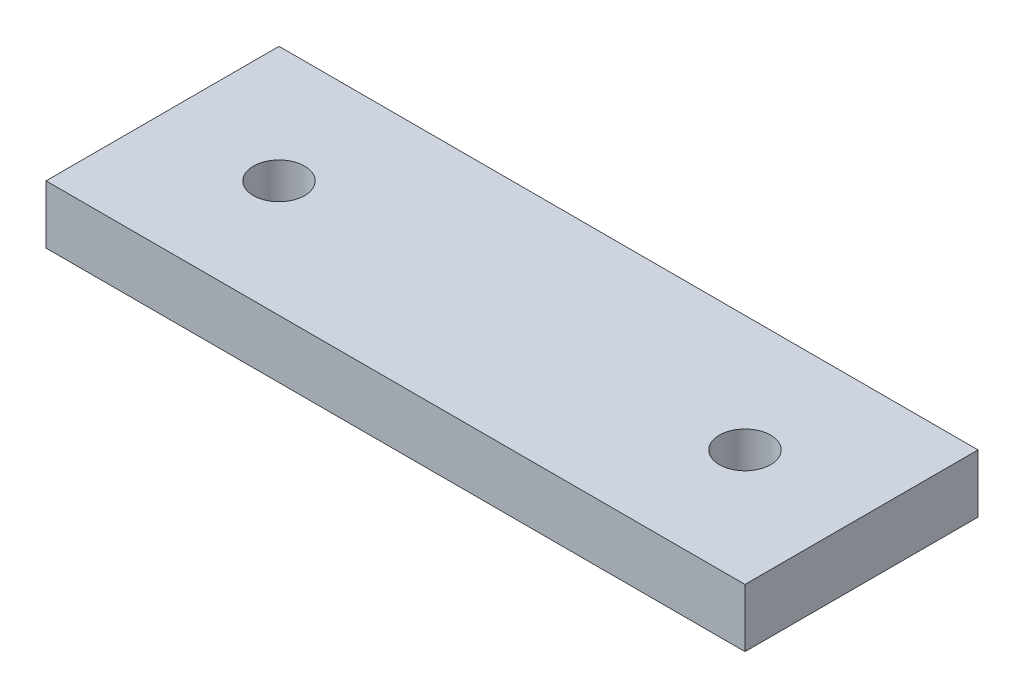
ISO-10303-21;
HEADER;
FILE_DESCRIPTION(('STEP AP214'),'2;1');
FILE_NAME('part.step','',(''),(''),'','','');
FILE_SCHEMA(('AUTOMOTIVE_DESIGN { 1 0 10303 214 1 1 1 1 }'));
ENDSEC;
DATA;
#1=APPLICATION_CONTEXT('core data for automotive mechanical design processes');
#2=APPLICATION_PROTOCOL_DEFINITION('international standard','automotive_design',2000,#1);
#3=PRODUCT_CONTEXT('',#1,'mechanical');
#4=PRODUCT('Part','Part','',(#3));
#5=PRODUCT_RELATED_PRODUCT_CATEGORY('part','',(#4));
#6=PRODUCT_DEFINITION_FORMATION('','',#4);
#7=PRODUCT_DEFINITION_CONTEXT('part definition',#1,'design');
#8=PRODUCT_DEFINITION('design','',#6,#7);
#9=PRODUCT_DEFINITION_SHAPE('','',#8);
#10=(LENGTH_UNIT() NAMED_UNIT(*) SI_UNIT(.MILLI.,.METRE.));
#11=(NAMED_UNIT(*) PLANE_ANGLE_UNIT() SI_UNIT($,.RADIAN.));
#12=(NAMED_UNIT(*) SI_UNIT($,.STERADIAN.) SOLID_ANGLE_UNIT());
#13=UNCERTAINTY_MEASURE_WITH_UNIT(LENGTH_MEASURE(1.E-05),#10,'distance_accuracy_value','');
#14=(GEOMETRIC_REPRESENTATION_CONTEXT(3) GLOBAL_UNCERTAINTY_ASSIGNED_CONTEXT((#13)) GLOBAL_UNIT_ASSIGNED_CONTEXT((#10,
#11,#12)) REPRESENTATION_CONTEXT('',''));
#15=CARTESIAN_POINT('',(0.,0.,0.));
#16=DIRECTION('',(0.,0.,1.));
#17=DIRECTION('',(1.,0.,0.));
#18=AXIS2_PLACEMENT_3D('',#15,#16,#17);
#19=CARTESIAN_POINT('',(0.,6.35,0.));
#20=DIRECTION('',(0.,-1.,0.));
#21=DIRECTION('',(0.,0.,-1.));
#22=AXIS2_PLACEMENT_3D('',#19,#20,#21);
#23=PLANE('',#22);
#24=DIRECTION('',(0.,0.,1.));
#25=VECTOR('',#24,1.);
#26=CARTESIAN_POINT('',(0.,6.35,0.));
#27=LINE('',#26,#25);
#28=CARTESIAN_POINT('',(0.,6.35,-25.4));
#29=VERTEX_POINT('',#28);
#30=CARTESIAN_POINT('',(0.,6.35,0.));
#31=VERTEX_POINT('',#30);
#32=EDGE_CURVE('E87',#29,#31,#27,.T.);
#33=ORIENTED_EDGE('',*,*,#32,.T.);
#34=DIRECTION('',(1.,0.,0.));
#35=VECTOR('',#34,1.);
#36=CARTESIAN_POINT('',(0.,6.35,0.));
#37=LINE('',#36,#35);
#38=CARTESIAN_POINT('',(76.2,6.35,0.));
#39=VERTEX_POINT('',#38);
#40=EDGE_CURVE('E82',#31,#39,#37,.T.);
#41=ORIENTED_EDGE('',*,*,#40,.T.);
#42=DIRECTION('',(0.,0.,-1.));
#43=VECTOR('',#42,1.);
#44=CARTESIAN_POINT('',(76.2,6.35,0.));
#45=LINE('',#44,#43);
#46=CARTESIAN_POINT('',(76.2,6.35,-25.4));
#47=VERTEX_POINT('',#46);
#48=EDGE_CURVE('E85',#39,#47,#45,.T.);
#49=ORIENTED_EDGE('',*,*,#48,.T.);
#50=DIRECTION('',(-1.,0.,0.));
#51=VECTOR('',#50,1.);
#52=CARTESIAN_POINT('',(0.,6.35,-25.4));
#53=LINE('',#52,#51);
#54=EDGE_CURVE('E52',#47,#29,#53,.T.);
#55=ORIENTED_EDGE('',*,*,#54,.T.);
#56=EDGE_LOOP('',(#33,#41,#49,#55));
#57=FACE_BOUND('',#56,.T.);
#58=CARTESIAN_POINT('',(63.5,6.35,-12.7));
#59=DIRECTION('',(0.,1.,0.));
#60=DIRECTION('',(0.,0.,1.));
#61=AXIS2_PLACEMENT_3D('',#58,#59,#60);
#62=CIRCLE('',#61,2.79400000000001);
#63=CARTESIAN_POINT('',(63.5,6.35,-9.90599999999999));
#64=VERTEX_POINT('',#63);
#65=EDGE_CURVE('E102',#64,#64,#62,.T.);
#66=ORIENTED_EDGE('',*,*,#65,.F.);
#67=EDGE_LOOP('',(#66));
#68=FACE_BOUND('',#67,.T.);
#69=CARTESIAN_POINT('',(12.7,6.35,-12.7));
#70=DIRECTION('',(0.,1.,0.));
#71=DIRECTION('',(0.,0.,1.));
#72=AXIS2_PLACEMENT_3D('',#69,#70,#71);
#73=CIRCLE('',#72,2.794);
#74=CARTESIAN_POINT('',(12.7,6.35,-9.906));
#75=VERTEX_POINT('',#74);
#76=EDGE_CURVE('E117',#75,#75,#73,.T.);
#77=ORIENTED_EDGE('',*,*,#76,.F.);
#78=EDGE_LOOP('',(#77));
#79=FACE_BOUND('',#78,.T.);
#80=ADVANCED_FACE('F35',(#57,#68,#79),#23,.F.);
#81=CARTESIAN_POINT('',(0.,0.,0.));
#82=DIRECTION('',(0.,-1.,0.));
#83=DIRECTION('',(0.,0.,-1.));
#84=AXIS2_PLACEMENT_3D('',#81,#82,#83);
#85=PLANE('',#84);
#86=CARTESIAN_POINT('',(63.5,0.,-12.7));
#87=DIRECTION('',(0.,1.,0.));
#88=DIRECTION('',(0.,0.,1.));
#89=AXIS2_PLACEMENT_3D('',#86,#87,#88);
#90=CIRCLE('',#89,2.79400000000001);
#91=CARTESIAN_POINT('',(63.5,0.,-9.90599999999999));
#92=VERTEX_POINT('',#91);
#93=EDGE_CURVE('E114',#92,#92,#90,.T.);
#94=ORIENTED_EDGE('',*,*,#93,.T.);
#95=EDGE_LOOP('',(#94));
#96=FACE_BOUND('',#95,.T.);
#97=DIRECTION('',(0.,0.,1.));
#98=VECTOR('',#97,1.);
#99=CARTESIAN_POINT('',(0.,0.,0.));
#100=LINE('',#99,#98);
#101=CARTESIAN_POINT('',(0.,0.,-25.4));
#102=VERTEX_POINT('',#101);
#103=CARTESIAN_POINT('',(0.,0.,0.));
#104=VERTEX_POINT('',#103);
#105=EDGE_CURVE('E99',#102,#104,#100,.T.);
#106=ORIENTED_EDGE('',*,*,#105,.F.);
#107=DIRECTION('',(-1.,0.,0.));
#108=VECTOR('',#107,1.);
#109=CARTESIAN_POINT('',(0.,0.,-25.4));
#110=LINE('',#109,#108);
#111=CARTESIAN_POINT('',(76.2,0.,-25.4));
#112=VERTEX_POINT('',#111);
#113=EDGE_CURVE('E75',#112,#102,#110,.T.);
#114=ORIENTED_EDGE('',*,*,#113,.F.);
#115=DIRECTION('',(0.,0.,-1.));
#116=VECTOR('',#115,1.);
#117=CARTESIAN_POINT('',(76.2,0.,0.));
#118=LINE('',#117,#116);
#119=CARTESIAN_POINT('',(76.2,0.,0.));
#120=VERTEX_POINT('',#119);
#121=EDGE_CURVE('E69',#120,#112,#118,.T.);
#122=ORIENTED_EDGE('',*,*,#121,.F.);
#123=DIRECTION('',(1.,0.,0.));
#124=VECTOR('',#123,1.);
#125=CARTESIAN_POINT('',(0.,0.,0.));
#126=LINE('',#125,#124);
#127=EDGE_CURVE('E91',#104,#120,#126,.T.);
#128=ORIENTED_EDGE('',*,*,#127,.F.);
#129=EDGE_LOOP('',(#106,#114,#122,#128));
#130=FACE_BOUND('',#129,.T.);
#131=CARTESIAN_POINT('',(12.7,0.,-12.7));
#132=DIRECTION('',(0.,1.,0.));
#133=DIRECTION('',(0.,0.,1.));
#134=AXIS2_PLACEMENT_3D('',#131,#132,#133);
#135=CIRCLE('',#134,2.794);
#136=CARTESIAN_POINT('',(12.7,0.,-9.906));
#137=VERTEX_POINT('',#136);
#138=EDGE_CURVE('E120',#137,#137,#135,.T.);
#139=ORIENTED_EDGE('',*,*,#138,.T.);
#140=EDGE_LOOP('',(#139));
#141=FACE_BOUND('',#140,.T.);
#142=ADVANCED_FACE('F110',(#96,#130,#141),#85,.T.);
#143=CARTESIAN_POINT('',(0.,6.35,0.));
#144=DIRECTION('',(1.,0.,0.));
#145=DIRECTION('',(0.,0.,-1.));
#146=AXIS2_PLACEMENT_3D('',#143,#144,#145);
#147=PLANE('',#146);
#148=ORIENTED_EDGE('',*,*,#105,.T.);
#149=DIRECTION('',(0.,-1.,0.));
#150=VECTOR('',#149,1.);
#151=CARTESIAN_POINT('',(0.,6.35,0.));
#152=LINE('',#151,#150);
#153=EDGE_CURVE('E11',#31,#104,#152,.T.);
#154=ORIENTED_EDGE('',*,*,#153,.F.);
#155=ORIENTED_EDGE('',*,*,#32,.F.);
#156=DIRECTION('',(0.,-1.,0.));
#157=VECTOR('',#156,1.);
#158=CARTESIAN_POINT('',(0.,6.35,-25.4));
#159=LINE('',#158,#157);
#160=EDGE_CURVE('E95',#29,#102,#159,.T.);
#161=ORIENTED_EDGE('',*,*,#160,.T.);
#162=EDGE_LOOP('',(#148,#154,#155,#161));
#163=FACE_BOUND('',#162,.T.);
#164=ADVANCED_FACE('F37',(#163),#147,.F.);
#165=CARTESIAN_POINT('',(0.,6.35,0.));
#166=DIRECTION('',(0.,0.,-1.));
#167=DIRECTION('',(-1.,0.,0.));
#168=AXIS2_PLACEMENT_3D('',#165,#166,#167);
#169=PLANE('',#168);
#170=ORIENTED_EDGE('',*,*,#127,.T.);
#171=DIRECTION('',(0.,-1.,0.));
#172=VECTOR('',#171,1.);
#173=CARTESIAN_POINT('',(76.2,6.35,0.));
#174=LINE('',#173,#172);
#175=EDGE_CURVE('E44',#39,#120,#174,.T.);
#176=ORIENTED_EDGE('',*,*,#175,.F.);
#177=ORIENTED_EDGE('',*,*,#40,.F.);
#178=ORIENTED_EDGE('',*,*,#153,.T.);
#179=EDGE_LOOP('',(#170,#176,#177,#178));
#180=FACE_BOUND('',#179,.T.);
#181=ADVANCED_FACE('F90',(#180),#169,.F.);
#182=CARTESIAN_POINT('',(76.2,6.35,0.));
#183=DIRECTION('',(-1.,0.,0.));
#184=DIRECTION('',(0.,0.,1.));
#185=AXIS2_PLACEMENT_3D('',#182,#183,#184);
#186=PLANE('',#185);
#187=ORIENTED_EDGE('',*,*,#121,.T.);
#188=DIRECTION('',(0.,-1.,0.));
#189=VECTOR('',#188,1.);
#190=CARTESIAN_POINT('',(76.2,6.35,-25.4));
#191=LINE('',#190,#189);
#192=EDGE_CURVE('E92',#47,#112,#191,.T.);
#193=ORIENTED_EDGE('',*,*,#192,.F.);
#194=ORIENTED_EDGE('',*,*,#48,.F.);
#195=ORIENTED_EDGE('',*,*,#175,.T.);
#196=EDGE_LOOP('',(#187,#193,#194,#195));
#197=FACE_BOUND('',#196,.T.);
#198=ADVANCED_FACE('F93',(#197),#186,.F.);
#199=CARTESIAN_POINT('',(0.,6.35,-25.4));
#200=DIRECTION('',(0.,0.,1.));
#201=DIRECTION('',(1.,0.,0.));
#202=AXIS2_PLACEMENT_3D('',#199,#200,#201);
#203=PLANE('',#202);
#204=ORIENTED_EDGE('',*,*,#113,.T.);
#205=ORIENTED_EDGE('',*,*,#160,.F.);
#206=ORIENTED_EDGE('',*,*,#54,.F.);
#207=ORIENTED_EDGE('',*,*,#192,.T.);
#208=EDGE_LOOP('',(#204,#205,#206,#207));
#209=FACE_BOUND('',#208,.T.);
#210=ADVANCED_FACE('F107',(#209),#203,.F.);
#211=CARTESIAN_POINT('',(63.5,6.35,-12.7));
#212=DIRECTION('',(0.,-1.,0.));
#213=DIRECTION('',(0.,0.,-1.));
#214=AXIS2_PLACEMENT_3D('',#211,#212,#213);
#215=CYLINDRICAL_SURFACE('',#214,2.79400000000001);
#216=ORIENTED_EDGE('',*,*,#65,.T.);
#217=EDGE_LOOP('',(#216));
#218=FACE_BOUND('',#217,.T.);
#219=ORIENTED_EDGE('',*,*,#93,.F.);
#220=EDGE_LOOP('',(#219));
#221=FACE_BOUND('',#220,.T.);
#222=ADVANCED_FACE('F137',(#218,#221),#215,.F.);
#223=CARTESIAN_POINT('',(12.7,6.35,-12.7));
#224=DIRECTION('',(0.,-1.,0.));
#225=DIRECTION('',(0.,0.,-1.));
#226=AXIS2_PLACEMENT_3D('',#223,#224,#225);
#227=CYLINDRICAL_SURFACE('',#226,2.794);
#228=ORIENTED_EDGE('',*,*,#76,.T.);
#229=EDGE_LOOP('',(#228));
#230=FACE_BOUND('',#229,.T.);
#231=ORIENTED_EDGE('',*,*,#138,.F.);
#232=EDGE_LOOP('',(#231));
#233=FACE_BOUND('',#232,.T.);
#234=ADVANCED_FACE('F126',(#230,#233),#227,.F.);
#235=CLOSED_SHELL('',(#80,#142,#164,#181,#198,#210,#222,#234));
#236=MANIFOLD_SOLID_BREP('B2',#235);
#237=ADVANCED_BREP_SHAPE_REPRESENTATION('',(#18,#236),#14);
#238=SHAPE_DEFINITION_REPRESENTATION(#9,#237);
ENDSEC;
END-ISO-10303-21;
